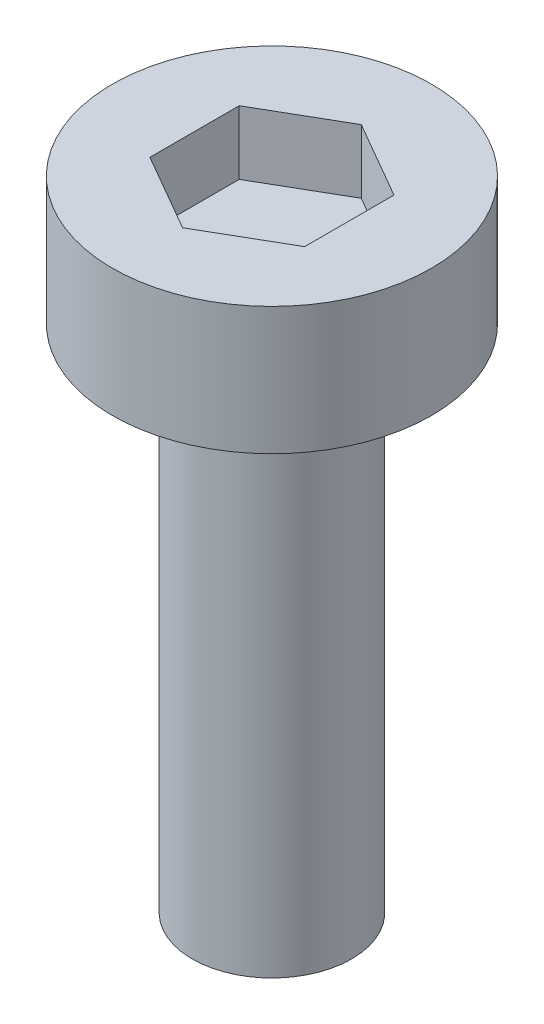
ISO-10303-21;
HEADER;
FILE_DESCRIPTION(('STEP AP214'),'2;1');
FILE_NAME('part.step','',(''),(''),'','','');
FILE_SCHEMA(('AUTOMOTIVE_DESIGN { 1 0 10303 214 1 1 1 1 }'));
ENDSEC;
DATA;
#1=APPLICATION_CONTEXT('core data for automotive mechanical design processes');
#2=APPLICATION_PROTOCOL_DEFINITION('international standard','automotive_design',2000,#1);
#3=PRODUCT_CONTEXT('',#1,'mechanical');
#4=PRODUCT('Part','Part','',(#3));
#5=PRODUCT_RELATED_PRODUCT_CATEGORY('part','',(#4));
#6=PRODUCT_DEFINITION_FORMATION('','',#4);
#7=PRODUCT_DEFINITION_CONTEXT('part definition',#1,'design');
#8=PRODUCT_DEFINITION('design','',#6,#7);
#9=PRODUCT_DEFINITION_SHAPE('','',#8);
#10=(LENGTH_UNIT() NAMED_UNIT(*) SI_UNIT(.MILLI.,.METRE.));
#11=(NAMED_UNIT(*) PLANE_ANGLE_UNIT() SI_UNIT($,.RADIAN.));
#12=(NAMED_UNIT(*) SI_UNIT($,.STERADIAN.) SOLID_ANGLE_UNIT());
#13=UNCERTAINTY_MEASURE_WITH_UNIT(LENGTH_MEASURE(1.E-05),#10,'distance_accuracy_value','');
#14=(GEOMETRIC_REPRESENTATION_CONTEXT(3) GLOBAL_UNCERTAINTY_ASSIGNED_CONTEXT((#13)) GLOBAL_UNIT_ASSIGNED_CONTEXT((#10,
#11,#12)) REPRESENTATION_CONTEXT('',''));
#15=CARTESIAN_POINT('',(0.,0.,0.));
#16=DIRECTION('',(0.,0.,1.));
#17=DIRECTION('',(1.,0.,0.));
#18=AXIS2_PLACEMENT_3D('',#15,#16,#17);
#19=CARTESIAN_POINT('',(2.5,0.,0.));
#20=DIRECTION('',(0.,-1.,0.));
#21=DIRECTION('',(1.,0.,0.));
#22=AXIS2_PLACEMENT_3D('',#19,#20,#21);
#23=PLANE('',#22);
#24=CARTESIAN_POINT('',(0.,0.,0.));
#25=DIRECTION('',(0.,-1.,0.));
#26=DIRECTION('',(1.,0.,0.));
#27=AXIS2_PLACEMENT_3D('',#24,#25,#26);
#28=CIRCLE('',#27,2.5);
#29=CARTESIAN_POINT('',(2.5,0.,0.));
#30=VERTEX_POINT('',#29);
#31=EDGE_CURVE('E135',#30,#30,#28,.T.);
#32=ORIENTED_EDGE('',*,*,#31,.T.);
#33=EDGE_LOOP('',(#32));
#34=FACE_BOUND('',#33,.T.);
#35=ADVANCED_FACE('F34',(#34),#23,.T.);
#36=CARTESIAN_POINT('',(0.,20.,0.));
#37=DIRECTION('',(0.,1.,0.));
#38=DIRECTION('',(-1.,0.,0.));
#39=AXIS2_PLACEMENT_3D('',#36,#37,#38);
#40=PLANE('',#39);
#41=DIRECTION('',(0.866025403784438,0.,0.5));
#42=VECTOR('',#41,1.);
#43=CARTESIAN_POINT('',(-2.425,20.,1.40007440278484));
#44=LINE('',#43,#42);
#45=CARTESIAN_POINT('',(-2.425,20.,1.40007440278484));
#46=VERTEX_POINT('',#45);
#47=CARTESIAN_POINT('',(0.,20.,2.80014880556968));
#48=VERTEX_POINT('',#47);
#49=EDGE_CURVE('E48',#46,#48,#44,.T.);
#50=ORIENTED_EDGE('',*,*,#49,.F.);
#51=DIRECTION('',(0.,0.,1.));
#52=VECTOR('',#51,1.);
#53=CARTESIAN_POINT('',(-2.425,20.,-1.40007440278484));
#54=LINE('',#53,#52);
#55=CARTESIAN_POINT('',(-2.425,20.,-1.40007440278484));
#56=VERTEX_POINT('',#55);
#57=EDGE_CURVE('E131',#56,#46,#54,.T.);
#58=ORIENTED_EDGE('',*,*,#57,.F.);
#59=DIRECTION('',(-0.866025403784439,0.,0.5));
#60=VECTOR('',#59,1.);
#61=CARTESIAN_POINT('',(0.,20.,-2.80014880556969));
#62=LINE('',#61,#60);
#63=CARTESIAN_POINT('',(0.,20.,-2.80014880556969));
#64=VERTEX_POINT('',#63);
#65=EDGE_CURVE('E129',#64,#56,#62,.T.);
#66=ORIENTED_EDGE('',*,*,#65,.F.);
#67=DIRECTION('',(-0.866025403784439,0.,-0.5));
#68=VECTOR('',#67,1.);
#69=CARTESIAN_POINT('',(2.425,20.,-1.40007440278484));
#70=LINE('',#69,#68);
#71=CARTESIAN_POINT('',(2.425,20.,-1.40007440278484));
#72=VERTEX_POINT('',#71);
#73=EDGE_CURVE('E96',#72,#64,#70,.T.);
#74=ORIENTED_EDGE('',*,*,#73,.F.);
#75=DIRECTION('',(0.,0.,-1.));
#76=VECTOR('',#75,1.);
#77=CARTESIAN_POINT('',(2.425,20.,1.40007440278484));
#78=LINE('',#77,#76);
#79=CARTESIAN_POINT('',(2.425,20.,1.40007440278484));
#80=VERTEX_POINT('',#79);
#81=EDGE_CURVE('E125',#80,#72,#78,.T.);
#82=ORIENTED_EDGE('',*,*,#81,.F.);
#83=DIRECTION('',(0.866025403784439,0.,-0.5));
#84=VECTOR('',#83,1.);
#85=CARTESIAN_POINT('',(0.,20.,2.80014880556968));
#86=LINE('',#85,#84);
#87=EDGE_CURVE('E122',#48,#80,#86,.T.);
#88=ORIENTED_EDGE('',*,*,#87,.F.);
#89=EDGE_LOOP('',(#50,#58,#66,#74,#82,#88));
#90=FACE_BOUND('',#89,.T.);
#91=CARTESIAN_POINT('',(0.,20.,0.));
#92=DIRECTION('',(0.,-1.,0.));
#93=DIRECTION('',(1.,0.,0.));
#94=AXIS2_PLACEMENT_3D('',#91,#92,#93);
#95=CIRCLE('',#94,5.);
#96=CARTESIAN_POINT('',(5.,20.,0.));
#97=VERTEX_POINT('',#96);
#98=EDGE_CURVE('E11',#97,#97,#95,.T.);
#99=ORIENTED_EDGE('',*,*,#98,.F.);
#100=EDGE_LOOP('',(#99));
#101=FACE_BOUND('',#100,.T.);
#102=ADVANCED_FACE('F153',(#90,#101),#40,.T.);
#103=CARTESIAN_POINT('',(0.,0.,0.));
#104=DIRECTION('',(0.,-1.,0.));
#105=DIRECTION('',(1.,0.,0.));
#106=AXIS2_PLACEMENT_3D('',#103,#104,#105);
#107=CYLINDRICAL_SURFACE('',#106,5.);
#108=ORIENTED_EDGE('',*,*,#98,.T.);
#109=EDGE_LOOP('',(#108));
#110=FACE_BOUND('',#109,.T.);
#111=CARTESIAN_POINT('',(0.,16.,0.));
#112=DIRECTION('',(0.,-1.,0.));
#113=DIRECTION('',(1.,0.,0.));
#114=AXIS2_PLACEMENT_3D('',#111,#112,#113);
#115=CIRCLE('',#114,5.);
#116=CARTESIAN_POINT('',(5.,16.,0.));
#117=VERTEX_POINT('',#116);
#118=EDGE_CURVE('E41',#117,#117,#115,.T.);
#119=ORIENTED_EDGE('',*,*,#118,.F.);
#120=EDGE_LOOP('',(#119));
#121=FACE_BOUND('',#120,.T.);
#122=ADVANCED_FACE('F151',(#110,#121),#107,.T.);
#123=CARTESIAN_POINT('',(5.,16.,0.));
#124=DIRECTION('',(0.,-1.,0.));
#125=DIRECTION('',(1.,0.,0.));
#126=AXIS2_PLACEMENT_3D('',#123,#124,#125);
#127=PLANE('',#126);
#128=ORIENTED_EDGE('',*,*,#118,.T.);
#129=EDGE_LOOP('',(#128));
#130=FACE_BOUND('',#129,.T.);
#131=CARTESIAN_POINT('',(0.,16.,0.));
#132=DIRECTION('',(0.,-1.,0.));
#133=DIRECTION('',(1.,0.,0.));
#134=AXIS2_PLACEMENT_3D('',#131,#132,#133);
#135=CIRCLE('',#134,2.5);
#136=CARTESIAN_POINT('',(2.5,16.,0.));
#137=VERTEX_POINT('',#136);
#138=EDGE_CURVE('E143',#137,#137,#135,.T.);
#139=ORIENTED_EDGE('',*,*,#138,.F.);
#140=EDGE_LOOP('',(#139));
#141=FACE_BOUND('',#140,.T.);
#142=ADVANCED_FACE('F148',(#130,#141),#127,.T.);
#143=CARTESIAN_POINT('',(0.,0.,0.));
#144=DIRECTION('',(0.,-1.,0.));
#145=DIRECTION('',(1.,0.,0.));
#146=AXIS2_PLACEMENT_3D('',#143,#144,#145);
#147=CYLINDRICAL_SURFACE('',#146,2.5);
#148=ORIENTED_EDGE('',*,*,#138,.T.);
#149=EDGE_LOOP('',(#148));
#150=FACE_BOUND('',#149,.T.);
#151=ORIENTED_EDGE('',*,*,#31,.F.);
#152=EDGE_LOOP('',(#151));
#153=FACE_BOUND('',#152,.T.);
#154=ADVANCED_FACE('F160',(#150,#153),#147,.T.);
#155=CARTESIAN_POINT('',(-2.425,18.,1.40007440278484));
#156=DIRECTION('',(-0.5,0.,0.866025403784439));
#157=DIRECTION('',(0.866025403784438,0.,0.5));
#158=AXIS2_PLACEMENT_3D('',#155,#156,#157);
#159=PLANE('',#158);
#160=ORIENTED_EDGE('',*,*,#49,.T.);
#161=DIRECTION('',(0.,1.,0.));
#162=VECTOR('',#161,1.);
#163=CARTESIAN_POINT('',(0.,18.,2.80014880556968));
#164=LINE('',#163,#162);
#165=CARTESIAN_POINT('',(0.,18.,2.80014880556968));
#166=VERTEX_POINT('',#165);
#167=EDGE_CURVE('E78',#166,#48,#164,.T.);
#168=ORIENTED_EDGE('',*,*,#167,.F.);
#169=DIRECTION('',(0.866025403784438,0.,0.5));
#170=VECTOR('',#169,1.);
#171=CARTESIAN_POINT('',(-2.425,18.,1.40007440278484));
#172=LINE('',#171,#170);
#173=CARTESIAN_POINT('',(-2.425,18.,1.40007440278484));
#174=VERTEX_POINT('',#173);
#175=EDGE_CURVE('E133',#174,#166,#172,.T.);
#176=ORIENTED_EDGE('',*,*,#175,.F.);
#177=DIRECTION('',(0.,1.,0.));
#178=VECTOR('',#177,1.);
#179=CARTESIAN_POINT('',(-2.425,18.,1.40007440278484));
#180=LINE('',#179,#178);
#181=EDGE_CURVE('E56',#174,#46,#180,.T.);
#182=ORIENTED_EDGE('',*,*,#181,.T.);
#183=EDGE_LOOP('',(#160,#168,#176,#182));
#184=FACE_BOUND('',#183,.T.);
#185=ADVANCED_FACE('F170',(#184),#159,.F.);
#186=CARTESIAN_POINT('',(-2.425,18.,-1.40007440278484));
#187=DIRECTION('',(-1.,0.,0.));
#188=DIRECTION('',(0.,-1.,0.));
#189=AXIS2_PLACEMENT_3D('',#186,#187,#188);
#190=PLANE('',#189);
#191=ORIENTED_EDGE('',*,*,#57,.T.);
#192=ORIENTED_EDGE('',*,*,#181,.F.);
#193=DIRECTION('',(0.,0.,1.));
#194=VECTOR('',#193,1.);
#195=CARTESIAN_POINT('',(-2.425,18.,-1.40007440278484));
#196=LINE('',#195,#194);
#197=CARTESIAN_POINT('',(-2.425,18.,-1.40007440278484));
#198=VERTEX_POINT('',#197);
#199=EDGE_CURVE('E108',#198,#174,#196,.T.);
#200=ORIENTED_EDGE('',*,*,#199,.F.);
#201=DIRECTION('',(0.,1.,0.));
#202=VECTOR('',#201,1.);
#203=CARTESIAN_POINT('',(-2.425,18.,-1.40007440278484));
#204=LINE('',#203,#202);
#205=EDGE_CURVE('E100',#198,#56,#204,.T.);
#206=ORIENTED_EDGE('',*,*,#205,.T.);
#207=EDGE_LOOP('',(#191,#192,#200,#206));
#208=FACE_BOUND('',#207,.T.);
#209=ADVANCED_FACE('F176',(#208),#190,.F.);
#210=CARTESIAN_POINT('',(0.,18.,-2.80014880556969));
#211=DIRECTION('',(-0.5,0.,-0.866025403784439));
#212=DIRECTION('',(-0.866025403784439,0.,0.5));
#213=AXIS2_PLACEMENT_3D('',#210,#211,#212);
#214=PLANE('',#213);
#215=ORIENTED_EDGE('',*,*,#65,.T.);
#216=ORIENTED_EDGE('',*,*,#205,.F.);
#217=DIRECTION('',(-0.866025403784439,0.,0.5));
#218=VECTOR('',#217,1.);
#219=CARTESIAN_POINT('',(0.,18.,-2.80014880556969));
#220=LINE('',#219,#218);
#221=CARTESIAN_POINT('',(0.,18.,-2.80014880556969));
#222=VERTEX_POINT('',#221);
#223=EDGE_CURVE('E104',#222,#198,#220,.T.);
#224=ORIENTED_EDGE('',*,*,#223,.F.);
#225=DIRECTION('',(0.,1.,0.));
#226=VECTOR('',#225,1.);
#227=CARTESIAN_POINT('',(0.,18.,-2.80014880556969));
#228=LINE('',#227,#226);
#229=EDGE_CURVE('E89',#222,#64,#228,.T.);
#230=ORIENTED_EDGE('',*,*,#229,.T.);
#231=EDGE_LOOP('',(#215,#216,#224,#230));
#232=FACE_BOUND('',#231,.T.);
#233=ADVANCED_FACE('F105',(#232),#214,.F.);
#234=CARTESIAN_POINT('',(2.425,18.,-1.40007440278484));
#235=DIRECTION('',(0.5,0.,-0.866025403784439));
#236=DIRECTION('',(-0.866025403784439,0.,-0.5));
#237=AXIS2_PLACEMENT_3D('',#234,#235,#236);
#238=PLANE('',#237);
#239=ORIENTED_EDGE('',*,*,#73,.T.);
#240=ORIENTED_EDGE('',*,*,#229,.F.);
#241=DIRECTION('',(-0.866025403784439,0.,-0.5));
#242=VECTOR('',#241,1.);
#243=CARTESIAN_POINT('',(2.425,18.,-1.40007440278484));
#244=LINE('',#243,#242);
#245=CARTESIAN_POINT('',(2.425,18.,-1.40007440278484));
#246=VERTEX_POINT('',#245);
#247=EDGE_CURVE('E93',#246,#222,#244,.T.);
#248=ORIENTED_EDGE('',*,*,#247,.F.);
#249=DIRECTION('',(0.,1.,0.));
#250=VECTOR('',#249,1.);
#251=CARTESIAN_POINT('',(2.425,18.,-1.40007440278484));
#252=LINE('',#251,#250);
#253=EDGE_CURVE('E101',#246,#72,#252,.T.);
#254=ORIENTED_EDGE('',*,*,#253,.T.);
#255=EDGE_LOOP('',(#239,#240,#248,#254));
#256=FACE_BOUND('',#255,.T.);
#257=ADVANCED_FACE('F91',(#256),#238,.F.);
#258=CARTESIAN_POINT('',(2.425,18.,1.40007440278484));
#259=DIRECTION('',(1.,0.,0.));
#260=DIRECTION('',(0.,1.,0.));
#261=AXIS2_PLACEMENT_3D('',#258,#259,#260);
#262=PLANE('',#261);
#263=ORIENTED_EDGE('',*,*,#81,.T.);
#264=ORIENTED_EDGE('',*,*,#253,.F.);
#265=DIRECTION('',(0.,0.,-1.));
#266=VECTOR('',#265,1.);
#267=CARTESIAN_POINT('',(2.425,18.,1.40007440278484));
#268=LINE('',#267,#266);
#269=CARTESIAN_POINT('',(2.425,18.,1.40007440278484));
#270=VERTEX_POINT('',#269);
#271=EDGE_CURVE('E114',#270,#246,#268,.T.);
#272=ORIENTED_EDGE('',*,*,#271,.F.);
#273=DIRECTION('',(0.,1.,0.));
#274=VECTOR('',#273,1.);
#275=CARTESIAN_POINT('',(2.425,18.,1.40007440278484));
#276=LINE('',#275,#274);
#277=EDGE_CURVE('E138',#270,#80,#276,.T.);
#278=ORIENTED_EDGE('',*,*,#277,.T.);
#279=EDGE_LOOP('',(#263,#264,#272,#278));
#280=FACE_BOUND('',#279,.T.);
#281=ADVANCED_FACE('F182',(#280),#262,.F.);
#282=CARTESIAN_POINT('',(0.,18.,2.80014880556968));
#283=DIRECTION('',(0.5,0.,0.866025403784439));
#284=DIRECTION('',(0.866025403784439,0.,-0.5));
#285=AXIS2_PLACEMENT_3D('',#282,#283,#284);
#286=PLANE('',#285);
#287=ORIENTED_EDGE('',*,*,#87,.T.);
#288=ORIENTED_EDGE('',*,*,#277,.F.);
#289=DIRECTION('',(0.866025403784439,0.,-0.5));
#290=VECTOR('',#289,1.);
#291=CARTESIAN_POINT('',(0.,18.,2.80014880556968));
#292=LINE('',#291,#290);
#293=EDGE_CURVE('E116',#166,#270,#292,.T.);
#294=ORIENTED_EDGE('',*,*,#293,.F.);
#295=ORIENTED_EDGE('',*,*,#167,.T.);
#296=EDGE_LOOP('',(#287,#288,#294,#295));
#297=FACE_BOUND('',#296,.T.);
#298=ADVANCED_FACE('F179',(#297),#286,.F.);
#299=CARTESIAN_POINT('',(0.,18.,0.));
#300=DIRECTION('',(0.,1.,0.));
#301=DIRECTION('',(0.,0.,1.));
#302=AXIS2_PLACEMENT_3D('',#299,#300,#301);
#303=PLANE('',#302);
#304=ORIENTED_EDGE('',*,*,#175,.T.);
#305=ORIENTED_EDGE('',*,*,#293,.T.);
#306=ORIENTED_EDGE('',*,*,#271,.T.);
#307=ORIENTED_EDGE('',*,*,#247,.T.);
#308=ORIENTED_EDGE('',*,*,#223,.T.);
#309=ORIENTED_EDGE('',*,*,#199,.T.);
#310=EDGE_LOOP('',(#304,#305,#306,#307,#308,#309));
#311=FACE_BOUND('',#310,.T.);
#312=ADVANCED_FACE('F111',(#311),#303,.T.);
#313=CLOSED_SHELL('',(#35,#102,#122,#142,#154,#185,#209,#233,#257,#281,#298,#312));
#314=MANIFOLD_SOLID_BREP('B2',#313);
#315=ADVANCED_BREP_SHAPE_REPRESENTATION('',(#18,#314),#14);
#316=SHAPE_DEFINITION_REPRESENTATION(#9,#315);
ENDSEC;
END-ISO-10303-21;
